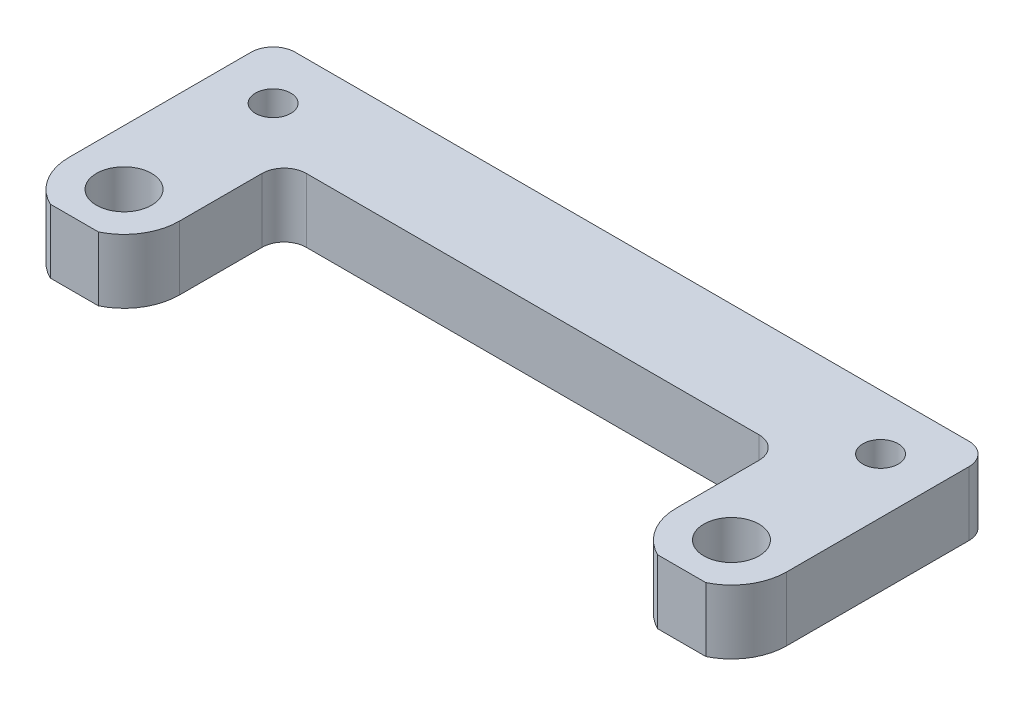
ISO-10303-21;
HEADER;
FILE_DESCRIPTION(('STEP AP214'),'2;1');
FILE_NAME('part.step','',(''),(''),'','','');
FILE_SCHEMA(('AUTOMOTIVE_DESIGN { 1 0 10303 214 1 1 1 1 }'));
ENDSEC;
DATA;
#1=APPLICATION_CONTEXT('core data for automotive mechanical design processes');
#2=APPLICATION_PROTOCOL_DEFINITION('international standard','automotive_design',2000,#1);
#3=PRODUCT_CONTEXT('',#1,'mechanical');
#4=PRODUCT('Part','Part','',(#3));
#5=PRODUCT_RELATED_PRODUCT_CATEGORY('part','',(#4));
#6=PRODUCT_DEFINITION_FORMATION('','',#4);
#7=PRODUCT_DEFINITION_CONTEXT('part definition',#1,'design');
#8=PRODUCT_DEFINITION('design','',#6,#7);
#9=PRODUCT_DEFINITION_SHAPE('','',#8);
#10=(LENGTH_UNIT() NAMED_UNIT(*) SI_UNIT(.MILLI.,.METRE.));
#11=(NAMED_UNIT(*) PLANE_ANGLE_UNIT() SI_UNIT($,.RADIAN.));
#12=(NAMED_UNIT(*) SI_UNIT($,.STERADIAN.) SOLID_ANGLE_UNIT());
#13=UNCERTAINTY_MEASURE_WITH_UNIT(LENGTH_MEASURE(1.E-05),#10,'distance_accuracy_value','');
#14=(GEOMETRIC_REPRESENTATION_CONTEXT(3) GLOBAL_UNCERTAINTY_ASSIGNED_CONTEXT((#13)) GLOBAL_UNIT_ASSIGNED_CONTEXT((#10,
#11,#12)) REPRESENTATION_CONTEXT('',''));
#15=CARTESIAN_POINT('',(0.,0.,0.));
#16=DIRECTION('',(0.,0.,1.));
#17=DIRECTION('',(1.,0.,0.));
#18=AXIS2_PLACEMENT_3D('',#15,#16,#17);
#19=CARTESIAN_POINT('',(-27.5,5.8,13.5));
#20=DIRECTION('',(0.,-1.,0.));
#21=DIRECTION('',(0.,0.,-1.));
#22=AXIS2_PLACEMENT_3D('',#19,#20,#21);
#23=CYLINDRICAL_SURFACE('',#22,5.);
#24=CARTESIAN_POINT('',(-27.5,0.,13.5));
#25=DIRECTION('',(0.,1.,0.));
#26=DIRECTION('',(0.,0.,1.));
#27=AXIS2_PLACEMENT_3D('',#24,#25,#26);
#28=CIRCLE('',#27,5.);
#29=CARTESIAN_POINT('',(-29.6794494717703,0.,18.));
#30=VERTEX_POINT('',#29);
#31=CARTESIAN_POINT('',(-32.5,0.,13.5));
#32=VERTEX_POINT('',#31);
#33=EDGE_CURVE('E158',#30,#32,#28,.F.);
#34=ORIENTED_EDGE('',*,*,#33,.F.);
#35=DIRECTION('',(0.,-1.,0.));
#36=VECTOR('',#35,1.);
#37=CARTESIAN_POINT('',(-29.6794494717703,5.8,18.));
#38=LINE('',#37,#36);
#39=CARTESIAN_POINT('',(-29.6794494717703,5.8,18.));
#40=VERTEX_POINT('',#39);
#41=EDGE_CURVE('E152',#40,#30,#38,.T.);
#42=ORIENTED_EDGE('',*,*,#41,.F.);
#43=CARTESIAN_POINT('',(-27.5,5.8,13.5));
#44=DIRECTION('',(0.,1.,0.));
#45=DIRECTION('',(0.,0.,1.));
#46=AXIS2_PLACEMENT_3D('',#43,#44,#45);
#47=CIRCLE('',#46,5.);
#48=CARTESIAN_POINT('',(-32.5,5.8,13.5));
#49=VERTEX_POINT('',#48);
#50=EDGE_CURVE('E156',#40,#49,#47,.F.);
#51=ORIENTED_EDGE('',*,*,#50,.T.);
#52=DIRECTION('',(0.,-1.,0.));
#53=VECTOR('',#52,1.);
#54=CARTESIAN_POINT('',(-32.5,5.8,13.5));
#55=LINE('',#54,#53);
#56=EDGE_CURVE('E312',#49,#32,#55,.T.);
#57=ORIENTED_EDGE('',*,*,#56,.T.);
#58=EDGE_LOOP('',(#34,#42,#51,#57));
#59=FACE_BOUND('',#58,.T.);
#60=ADVANCED_FACE('F37',(#59),#23,.T.);
#61=CARTESIAN_POINT('',(0.,5.8,18.));
#62=DIRECTION('',(0.,0.,-1.));
#63=DIRECTION('',(-1.,0.,0.));
#64=AXIS2_PLACEMENT_3D('',#61,#62,#63);
#65=PLANE('',#64);
#66=DIRECTION('',(1.,0.,0.));
#67=VECTOR('',#66,1.);
#68=CARTESIAN_POINT('',(0.,0.,18.));
#69=LINE('',#68,#67);
#70=CARTESIAN_POINT('',(-25.3205505282297,0.,18.));
#71=VERTEX_POINT('',#70);
#72=EDGE_CURVE('E314',#30,#71,#69,.T.);
#73=ORIENTED_EDGE('',*,*,#72,.T.);
#74=DIRECTION('',(0.,-1.,0.));
#75=VECTOR('',#74,1.);
#76=CARTESIAN_POINT('',(-25.3205505282297,5.8,18.));
#77=LINE('',#76,#75);
#78=CARTESIAN_POINT('',(-25.3205505282297,5.8,18.));
#79=VERTEX_POINT('',#78);
#80=EDGE_CURVE('E163',#79,#71,#77,.T.);
#81=ORIENTED_EDGE('',*,*,#80,.F.);
#82=DIRECTION('',(1.,0.,0.));
#83=VECTOR('',#82,1.);
#84=CARTESIAN_POINT('',(0.,5.8,18.));
#85=LINE('',#84,#83);
#86=EDGE_CURVE('E166',#40,#79,#85,.T.);
#87=ORIENTED_EDGE('',*,*,#86,.F.);
#88=ORIENTED_EDGE('',*,*,#41,.T.);
#89=EDGE_LOOP('',(#73,#81,#87,#88));
#90=FACE_BOUND('',#89,.T.);
#91=ADVANCED_FACE('F167',(#90),#65,.F.);
#92=CARTESIAN_POINT('',(-27.5,5.8,13.5));
#93=DIRECTION('',(0.,-1.,0.));
#94=DIRECTION('',(0.,0.,-1.));
#95=AXIS2_PLACEMENT_3D('',#92,#93,#94);
#96=CYLINDRICAL_SURFACE('',#95,5.);
#97=CARTESIAN_POINT('',(-27.5,0.,13.5));
#98=DIRECTION('',(0.,1.,0.));
#99=DIRECTION('',(0.,0.,1.));
#100=AXIS2_PLACEMENT_3D('',#97,#98,#99);
#101=CIRCLE('',#100,5.);
#102=CARTESIAN_POINT('',(-22.5,0.,13.5));
#103=VERTEX_POINT('',#102);
#104=EDGE_CURVE('E316',#103,#71,#101,.F.);
#105=ORIENTED_EDGE('',*,*,#104,.F.);
#106=DIRECTION('',(0.,-1.,0.));
#107=VECTOR('',#106,1.);
#108=CARTESIAN_POINT('',(-22.5,5.8,13.5));
#109=LINE('',#108,#107);
#110=CARTESIAN_POINT('',(-22.5,5.8,13.5));
#111=VERTEX_POINT('',#110);
#112=EDGE_CURVE('E348',#111,#103,#109,.T.);
#113=ORIENTED_EDGE('',*,*,#112,.F.);
#114=CARTESIAN_POINT('',(-27.5,5.8,13.5));
#115=DIRECTION('',(0.,1.,0.));
#116=DIRECTION('',(0.,0.,1.));
#117=AXIS2_PLACEMENT_3D('',#114,#115,#116);
#118=CIRCLE('',#117,5.);
#119=EDGE_CURVE('E170',#111,#79,#118,.F.);
#120=ORIENTED_EDGE('',*,*,#119,.T.);
#121=ORIENTED_EDGE('',*,*,#80,.T.);
#122=EDGE_LOOP('',(#105,#113,#120,#121));
#123=FACE_BOUND('',#122,.T.);
#124=ADVANCED_FACE('F351',(#123),#96,.T.);
#125=CARTESIAN_POINT('',(-22.5,5.8,0.));
#126=DIRECTION('',(-1.,0.,0.));
#127=DIRECTION('',(0.,0.,1.));
#128=AXIS2_PLACEMENT_3D('',#125,#126,#127);
#129=PLANE('',#128);
#130=DIRECTION('',(0.,0.,-1.));
#131=VECTOR('',#130,1.);
#132=CARTESIAN_POINT('',(-22.5,0.,0.));
#133=LINE('',#132,#131);
#134=CARTESIAN_POINT('',(-22.5,0.,6.));
#135=VERTEX_POINT('',#134);
#136=EDGE_CURVE('E258',#103,#135,#133,.T.);
#137=ORIENTED_EDGE('',*,*,#136,.T.);
#138=DIRECTION('',(0.,-1.,0.));
#139=VECTOR('',#138,1.);
#140=CARTESIAN_POINT('',(-22.5,5.8,6.));
#141=LINE('',#140,#139);
#142=CARTESIAN_POINT('',(-22.5,5.8,6.));
#143=VERTEX_POINT('',#142);
#144=EDGE_CURVE('E263',#135,#143,#141,.F.);
#145=ORIENTED_EDGE('',*,*,#144,.T.);
#146=DIRECTION('',(0.,0.,-1.));
#147=VECTOR('',#146,1.);
#148=CARTESIAN_POINT('',(-22.5,5.8,0.));
#149=LINE('',#148,#147);
#150=EDGE_CURVE('E192',#111,#143,#149,.T.);
#151=ORIENTED_EDGE('',*,*,#150,.F.);
#152=ORIENTED_EDGE('',*,*,#112,.T.);
#153=EDGE_LOOP('',(#137,#145,#151,#152));
#154=FACE_BOUND('',#153,.T.);
#155=ADVANCED_FACE('F355',(#154),#129,.F.);
#156=CARTESIAN_POINT('',(0.,5.8,4.));
#157=DIRECTION('',(0.,0.,-1.));
#158=DIRECTION('',(-1.,0.,0.));
#159=AXIS2_PLACEMENT_3D('',#156,#157,#158);
#160=PLANE('',#159);
#161=DIRECTION('',(1.,0.,0.));
#162=VECTOR('',#161,1.);
#163=CARTESIAN_POINT('',(0.,5.8,4.));
#164=LINE('',#163,#162);
#165=CARTESIAN_POINT('',(-20.5,5.8,4.));
#166=VERTEX_POINT('',#165);
#167=CARTESIAN_POINT('',(20.5,5.8,4.));
#168=VERTEX_POINT('',#167);
#169=EDGE_CURVE('E195',#166,#168,#164,.T.);
#170=ORIENTED_EDGE('',*,*,#169,.F.);
#171=DIRECTION('',(0.,-1.,0.));
#172=VECTOR('',#171,1.);
#173=CARTESIAN_POINT('',(-20.5,0.,4.));
#174=LINE('',#173,#172);
#175=CARTESIAN_POINT('',(-20.5,0.,4.));
#176=VERTEX_POINT('',#175);
#177=EDGE_CURVE('E257',#166,#176,#174,.T.);
#178=ORIENTED_EDGE('',*,*,#177,.T.);
#179=DIRECTION('',(1.,0.,0.));
#180=VECTOR('',#179,1.);
#181=CARTESIAN_POINT('',(0.,0.,4.));
#182=LINE('',#181,#180);
#183=CARTESIAN_POINT('',(20.5,0.,4.));
#184=VERTEX_POINT('',#183);
#185=EDGE_CURVE('E244',#176,#184,#182,.T.);
#186=ORIENTED_EDGE('',*,*,#185,.T.);
#187=DIRECTION('',(0.,-1.,0.));
#188=VECTOR('',#187,1.);
#189=CARTESIAN_POINT('',(20.5,5.8,4.));
#190=LINE('',#189,#188);
#191=EDGE_CURVE('E162',#184,#168,#190,.F.);
#192=ORIENTED_EDGE('',*,*,#191,.T.);
#193=EDGE_LOOP('',(#170,#178,#186,#192));
#194=FACE_BOUND('',#193,.T.);
#195=ADVANCED_FACE('F255',(#194),#160,.F.);
#196=CARTESIAN_POINT('',(22.5,5.8,0.));
#197=DIRECTION('',(-1.,0.,0.));
#198=DIRECTION('',(0.,0.,1.));
#199=AXIS2_PLACEMENT_3D('',#196,#197,#198);
#200=PLANE('',#199);
#201=DIRECTION('',(0.,0.,-1.));
#202=VECTOR('',#201,1.);
#203=CARTESIAN_POINT('',(22.5,5.8,0.));
#204=LINE('',#203,#202);
#205=CARTESIAN_POINT('',(22.5,5.8,13.5));
#206=VERTEX_POINT('',#205);
#207=CARTESIAN_POINT('',(22.5,5.8,6.));
#208=VERTEX_POINT('',#207);
#209=EDGE_CURVE('E199',#206,#208,#204,.T.);
#210=ORIENTED_EDGE('',*,*,#209,.T.);
#211=DIRECTION('',(0.,-1.,0.));
#212=VECTOR('',#211,1.);
#213=CARTESIAN_POINT('',(22.5,5.8,6.));
#214=LINE('',#213,#212);
#215=CARTESIAN_POINT('',(22.5,0.,6.));
#216=VERTEX_POINT('',#215);
#217=EDGE_CURVE('E268',#208,#216,#214,.T.);
#218=ORIENTED_EDGE('',*,*,#217,.T.);
#219=DIRECTION('',(0.,0.,-1.));
#220=VECTOR('',#219,1.);
#221=CARTESIAN_POINT('',(22.5,0.,0.));
#222=LINE('',#221,#220);
#223=CARTESIAN_POINT('',(22.5,0.,13.5));
#224=VERTEX_POINT('',#223);
#225=EDGE_CURVE('E247',#224,#216,#222,.T.);
#226=ORIENTED_EDGE('',*,*,#225,.F.);
#227=DIRECTION('',(0.,-1.,0.));
#228=VECTOR('',#227,1.);
#229=CARTESIAN_POINT('',(22.5,5.8,13.5));
#230=LINE('',#229,#228);
#231=EDGE_CURVE('E346',#206,#224,#230,.T.);
#232=ORIENTED_EDGE('',*,*,#231,.F.);
#233=EDGE_LOOP('',(#210,#218,#226,#232));
#234=FACE_BOUND('',#233,.T.);
#235=ADVANCED_FACE('F362',(#234),#200,.T.);
#236=CARTESIAN_POINT('',(27.5,5.8,13.5));
#237=DIRECTION('',(0.,-1.,0.));
#238=DIRECTION('',(0.,0.,-1.));
#239=AXIS2_PLACEMENT_3D('',#236,#237,#238);
#240=CYLINDRICAL_SURFACE('',#239,5.);
#241=CARTESIAN_POINT('',(27.5,0.,13.5));
#242=DIRECTION('',(0.,1.,0.));
#243=DIRECTION('',(0.,0.,1.));
#244=AXIS2_PLACEMENT_3D('',#241,#242,#243);
#245=CIRCLE('',#244,5.);
#246=CARTESIAN_POINT('',(25.3205505282297,0.,18.));
#247=VERTEX_POINT('',#246);
#248=EDGE_CURVE('E322',#224,#247,#245,.T.);
#249=ORIENTED_EDGE('',*,*,#248,.T.);
#250=DIRECTION('',(0.,-1.,0.));
#251=VECTOR('',#250,1.);
#252=CARTESIAN_POINT('',(25.3205505282297,5.8,18.));
#253=LINE('',#252,#251);
#254=CARTESIAN_POINT('',(25.3205505282297,5.8,18.));
#255=VERTEX_POINT('',#254);
#256=EDGE_CURVE('E344',#255,#247,#253,.T.);
#257=ORIENTED_EDGE('',*,*,#256,.F.);
#258=CARTESIAN_POINT('',(27.5,5.8,13.5));
#259=DIRECTION('',(0.,1.,0.));
#260=DIRECTION('',(0.,0.,1.));
#261=AXIS2_PLACEMENT_3D('',#258,#259,#260);
#262=CIRCLE('',#261,5.);
#263=EDGE_CURVE('E203',#206,#255,#262,.T.);
#264=ORIENTED_EDGE('',*,*,#263,.F.);
#265=ORIENTED_EDGE('',*,*,#231,.T.);
#266=EDGE_LOOP('',(#249,#257,#264,#265));
#267=FACE_BOUND('',#266,.T.);
#268=ADVANCED_FACE('F366',(#267),#240,.T.);
#269=CARTESIAN_POINT('',(0.,5.8,18.));
#270=DIRECTION('',(0.,0.,1.));
#271=DIRECTION('',(1.,0.,0.));
#272=AXIS2_PLACEMENT_3D('',#269,#270,#271);
#273=PLANE('',#272);
#274=DIRECTION('',(-1.,0.,0.));
#275=VECTOR('',#274,1.);
#276=CARTESIAN_POINT('',(0.,0.,18.));
#277=LINE('',#276,#275);
#278=CARTESIAN_POINT('',(29.6794494717703,0.,18.));
#279=VERTEX_POINT('',#278);
#280=EDGE_CURVE('E325',#279,#247,#277,.T.);
#281=ORIENTED_EDGE('',*,*,#280,.F.);
#282=DIRECTION('',(0.,-1.,0.));
#283=VECTOR('',#282,1.);
#284=CARTESIAN_POINT('',(29.6794494717703,5.8,18.));
#285=LINE('',#284,#283);
#286=CARTESIAN_POINT('',(29.6794494717703,5.8,18.));
#287=VERTEX_POINT('',#286);
#288=EDGE_CURVE('E342',#287,#279,#285,.T.);
#289=ORIENTED_EDGE('',*,*,#288,.F.);
#290=DIRECTION('',(-1.,0.,0.));
#291=VECTOR('',#290,1.);
#292=CARTESIAN_POINT('',(0.,5.8,18.));
#293=LINE('',#292,#291);
#294=EDGE_CURVE('E210',#287,#255,#293,.T.);
#295=ORIENTED_EDGE('',*,*,#294,.T.);
#296=ORIENTED_EDGE('',*,*,#256,.T.);
#297=EDGE_LOOP('',(#281,#289,#295,#296));
#298=FACE_BOUND('',#297,.T.);
#299=ADVANCED_FACE('F371',(#298),#273,.T.);
#300=CARTESIAN_POINT('',(27.5,5.8,13.5));
#301=DIRECTION('',(0.,-1.,0.));
#302=DIRECTION('',(0.,0.,-1.));
#303=AXIS2_PLACEMENT_3D('',#300,#301,#302);
#304=CYLINDRICAL_SURFACE('',#303,5.);
#305=CARTESIAN_POINT('',(27.5,0.,13.5));
#306=DIRECTION('',(0.,1.,0.));
#307=DIRECTION('',(0.,0.,1.));
#308=AXIS2_PLACEMENT_3D('',#305,#306,#307);
#309=CIRCLE('',#308,5.);
#310=CARTESIAN_POINT('',(32.5,0.,13.5));
#311=VERTEX_POINT('',#310);
#312=EDGE_CURVE('E289',#279,#311,#309,.T.);
#313=ORIENTED_EDGE('',*,*,#312,.T.);
#314=DIRECTION('',(0.,-1.,0.));
#315=VECTOR('',#314,1.);
#316=CARTESIAN_POINT('',(32.5,5.8,13.5));
#317=LINE('',#316,#315);
#318=CARTESIAN_POINT('',(32.5,5.8,13.5));
#319=VERTEX_POINT('',#318);
#320=EDGE_CURVE('E288',#319,#311,#317,.T.);
#321=ORIENTED_EDGE('',*,*,#320,.F.);
#322=CARTESIAN_POINT('',(27.5,5.8,13.5));
#323=DIRECTION('',(0.,1.,0.));
#324=DIRECTION('',(0.,0.,1.));
#325=AXIS2_PLACEMENT_3D('',#322,#323,#324);
#326=CIRCLE('',#325,5.);
#327=EDGE_CURVE('E213',#287,#319,#326,.T.);
#328=ORIENTED_EDGE('',*,*,#327,.F.);
#329=ORIENTED_EDGE('',*,*,#288,.T.);
#330=EDGE_LOOP('',(#313,#321,#328,#329));
#331=FACE_BOUND('',#330,.T.);
#332=ADVANCED_FACE('F373',(#331),#304,.T.);
#333=CARTESIAN_POINT('',(32.5,5.8,0.));
#334=DIRECTION('',(-1.,0.,0.));
#335=DIRECTION('',(0.,0.,1.));
#336=AXIS2_PLACEMENT_3D('',#333,#334,#335);
#337=PLANE('',#336);
#338=DIRECTION('',(0.,0.,-1.));
#339=VECTOR('',#338,1.);
#340=CARTESIAN_POINT('',(32.5,0.,0.));
#341=LINE('',#340,#339);
#342=CARTESIAN_POINT('',(32.5,0.,-3.));
#343=VERTEX_POINT('',#342);
#344=EDGE_CURVE('E280',#311,#343,#341,.T.);
#345=ORIENTED_EDGE('',*,*,#344,.T.);
#346=DIRECTION('',(0.,-1.,0.));
#347=VECTOR('',#346,1.);
#348=CARTESIAN_POINT('',(32.5,5.8,-3.));
#349=LINE('',#348,#347);
#350=CARTESIAN_POINT('',(32.5,5.8,-3.));
#351=VERTEX_POINT('',#350);
#352=EDGE_CURVE('E60',#343,#351,#349,.F.);
#353=ORIENTED_EDGE('',*,*,#352,.T.);
#354=DIRECTION('',(0.,0.,-1.));
#355=VECTOR('',#354,1.);
#356=CARTESIAN_POINT('',(32.5,5.8,0.));
#357=LINE('',#356,#355);
#358=EDGE_CURVE('E216',#319,#351,#357,.T.);
#359=ORIENTED_EDGE('',*,*,#358,.F.);
#360=ORIENTED_EDGE('',*,*,#320,.T.);
#361=EDGE_LOOP('',(#345,#353,#359,#360));
#362=FACE_BOUND('',#361,.T.);
#363=ADVANCED_FACE('F286',(#362),#337,.F.);
#364=CARTESIAN_POINT('',(0.,5.8,-5.));
#365=DIRECTION('',(0.,0.,-1.));
#366=DIRECTION('',(-1.,0.,0.));
#367=AXIS2_PLACEMENT_3D('',#364,#365,#366);
#368=PLANE('',#367);
#369=DIRECTION('',(1.,0.,0.));
#370=VECTOR('',#369,1.);
#371=CARTESIAN_POINT('',(0.,5.8,-5.));
#372=LINE('',#371,#370);
#373=CARTESIAN_POINT('',(-30.5,5.8,-5.));
#374=VERTEX_POINT('',#373);
#375=CARTESIAN_POINT('',(30.5,5.8,-5.));
#376=VERTEX_POINT('',#375);
#377=EDGE_CURVE('E219',#374,#376,#372,.T.);
#378=ORIENTED_EDGE('',*,*,#377,.T.);
#379=DIRECTION('',(0.,-1.,0.));
#380=VECTOR('',#379,1.);
#381=CARTESIAN_POINT('',(30.5,0.,-5.));
#382=LINE('',#381,#380);
#383=CARTESIAN_POINT('',(30.5,0.,-5.));
#384=VERTEX_POINT('',#383);
#385=EDGE_CURVE('E272',#376,#384,#382,.T.);
#386=ORIENTED_EDGE('',*,*,#385,.T.);
#387=DIRECTION('',(1.,0.,0.));
#388=VECTOR('',#387,1.);
#389=CARTESIAN_POINT('',(0.,0.,-5.));
#390=LINE('',#389,#388);
#391=CARTESIAN_POINT('',(-30.5,0.,-5.));
#392=VERTEX_POINT('',#391);
#393=EDGE_CURVE('E282',#392,#384,#390,.T.);
#394=ORIENTED_EDGE('',*,*,#393,.F.);
#395=DIRECTION('',(0.,-1.,0.));
#396=VECTOR('',#395,1.);
#397=CARTESIAN_POINT('',(-30.5,5.8,-5.));
#398=LINE('',#397,#396);
#399=EDGE_CURVE('E270',#392,#374,#398,.F.);
#400=ORIENTED_EDGE('',*,*,#399,.T.);
#401=EDGE_LOOP('',(#378,#386,#394,#400));
#402=FACE_BOUND('',#401,.T.);
#403=ADVANCED_FACE('F295',(#402),#368,.T.);
#404=CARTESIAN_POINT('',(27.5,5.8,13.5));
#405=DIRECTION('',(0.,-1.,0.));
#406=DIRECTION('',(0.,0.,-1.));
#407=AXIS2_PLACEMENT_3D('',#404,#405,#406);
#408=CYLINDRICAL_SURFACE('',#407,2.5);
#409=CARTESIAN_POINT('',(27.5,5.8,13.5));
#410=DIRECTION('',(0.,1.,0.));
#411=DIRECTION('',(0.,0.,1.));
#412=AXIS2_PLACEMENT_3D('',#409,#410,#411);
#413=CIRCLE('',#412,2.5);
#414=CARTESIAN_POINT('',(27.5,5.8,16.));
#415=VERTEX_POINT('',#414);
#416=EDGE_CURVE('E305',#415,#415,#413,.T.);
#417=ORIENTED_EDGE('',*,*,#416,.T.);
#418=EDGE_LOOP('',(#417));
#419=FACE_BOUND('',#418,.T.);
#420=CARTESIAN_POINT('',(27.5,0.,13.5));
#421=DIRECTION('',(0.,1.,0.));
#422=DIRECTION('',(0.,0.,1.));
#423=AXIS2_PLACEMENT_3D('',#420,#421,#422);
#424=CIRCLE('',#423,2.5);
#425=CARTESIAN_POINT('',(27.5,0.,16.));
#426=VERTEX_POINT('',#425);
#427=EDGE_CURVE('E179',#426,#426,#424,.T.);
#428=ORIENTED_EDGE('',*,*,#427,.F.);
#429=EDGE_LOOP('',(#428));
#430=FACE_BOUND('',#429,.T.);
#431=ADVANCED_FACE('F420',(#419,#430),#408,.F.);
#432=CARTESIAN_POINT('',(27.5,5.8,0.));
#433=DIRECTION('',(0.,-1.,0.));
#434=DIRECTION('',(0.,0.,-1.));
#435=AXIS2_PLACEMENT_3D('',#432,#433,#434);
#436=CYLINDRICAL_SURFACE('',#435,1.6);
#437=CARTESIAN_POINT('',(27.5,5.8,0.));
#438=DIRECTION('',(0.,1.,0.));
#439=DIRECTION('',(0.,0.,1.));
#440=AXIS2_PLACEMENT_3D('',#437,#438,#439);
#441=CIRCLE('',#440,1.6);
#442=CARTESIAN_POINT('',(27.5,5.8,1.6));
#443=VERTEX_POINT('',#442);
#444=EDGE_CURVE('E299',#443,#443,#441,.T.);
#445=ORIENTED_EDGE('',*,*,#444,.T.);
#446=EDGE_LOOP('',(#445));
#447=FACE_BOUND('',#446,.T.);
#448=CARTESIAN_POINT('',(27.5,0.,0.));
#449=DIRECTION('',(0.,1.,0.));
#450=DIRECTION('',(0.,0.,1.));
#451=AXIS2_PLACEMENT_3D('',#448,#449,#450);
#452=CIRCLE('',#451,1.6);
#453=CARTESIAN_POINT('',(27.5,0.,1.6));
#454=VERTEX_POINT('',#453);
#455=EDGE_CURVE('E335',#454,#454,#452,.T.);
#456=ORIENTED_EDGE('',*,*,#455,.F.);
#457=EDGE_LOOP('',(#456));
#458=FACE_BOUND('',#457,.T.);
#459=ADVANCED_FACE('F414',(#447,#458),#436,.F.);
#460=CARTESIAN_POINT('',(-27.5,5.8,0.));
#461=DIRECTION('',(0.,-1.,0.));
#462=DIRECTION('',(0.,0.,-1.));
#463=AXIS2_PLACEMENT_3D('',#460,#461,#462);
#464=CYLINDRICAL_SURFACE('',#463,1.6);
#465=CARTESIAN_POINT('',(-27.5,5.8,0.));
#466=DIRECTION('',(0.,1.,0.));
#467=DIRECTION('',(0.,0.,1.));
#468=AXIS2_PLACEMENT_3D('',#465,#466,#467);
#469=CIRCLE('',#468,1.6);
#470=CARTESIAN_POINT('',(-27.5,5.8,1.6));
#471=VERTEX_POINT('',#470);
#472=EDGE_CURVE('E297',#471,#471,#469,.F.);
#473=ORIENTED_EDGE('',*,*,#472,.F.);
#474=EDGE_LOOP('',(#473));
#475=FACE_BOUND('',#474,.T.);
#476=CARTESIAN_POINT('',(-27.5,0.,0.));
#477=DIRECTION('',(0.,1.,0.));
#478=DIRECTION('',(0.,0.,1.));
#479=AXIS2_PLACEMENT_3D('',#476,#477,#478);
#480=CIRCLE('',#479,1.6);
#481=CARTESIAN_POINT('',(-27.5,0.,1.6));
#482=VERTEX_POINT('',#481);
#483=EDGE_CURVE('E332',#482,#482,#480,.F.);
#484=ORIENTED_EDGE('',*,*,#483,.T.);
#485=EDGE_LOOP('',(#484));
#486=FACE_BOUND('',#485,.T.);
#487=ADVANCED_FACE('F406',(#475,#486),#464,.F.);
#488=CARTESIAN_POINT('',(-32.5,5.8,0.));
#489=DIRECTION('',(1.,0.,0.));
#490=DIRECTION('',(0.,0.,-1.));
#491=AXIS2_PLACEMENT_3D('',#488,#489,#490);
#492=PLANE('',#491);
#493=DIRECTION('',(0.,0.,1.));
#494=VECTOR('',#493,1.);
#495=CARTESIAN_POINT('',(-32.5,5.8,0.));
#496=LINE('',#495,#494);
#497=CARTESIAN_POINT('',(-32.5,5.8,-3.));
#498=VERTEX_POINT('',#497);
#499=EDGE_CURVE('E174',#498,#49,#496,.T.);
#500=ORIENTED_EDGE('',*,*,#499,.F.);
#501=DIRECTION('',(0.,-1.,0.));
#502=VECTOR('',#501,1.);
#503=CARTESIAN_POINT('',(-32.5,0.,-3.));
#504=LINE('',#503,#502);
#505=CARTESIAN_POINT('',(-32.5,0.,-3.));
#506=VERTEX_POINT('',#505);
#507=EDGE_CURVE('E229',#498,#506,#504,.T.);
#508=ORIENTED_EDGE('',*,*,#507,.T.);
#509=DIRECTION('',(0.,0.,1.));
#510=VECTOR('',#509,1.);
#511=CARTESIAN_POINT('',(-32.5,0.,0.));
#512=LINE('',#511,#510);
#513=EDGE_CURVE('E330',#506,#32,#512,.T.);
#514=ORIENTED_EDGE('',*,*,#513,.T.);
#515=ORIENTED_EDGE('',*,*,#56,.F.);
#516=EDGE_LOOP('',(#500,#508,#514,#515));
#517=FACE_BOUND('',#516,.T.);
#518=ADVANCED_FACE('F403',(#517),#492,.F.);
#519=CARTESIAN_POINT('',(-27.5,5.8,13.5));
#520=DIRECTION('',(0.,-1.,0.));
#521=DIRECTION('',(0.,0.,-1.));
#522=AXIS2_PLACEMENT_3D('',#519,#520,#521);
#523=CYLINDRICAL_SURFACE('',#522,2.5);
#524=CARTESIAN_POINT('',(-27.5,5.8,13.5));
#525=DIRECTION('',(0.,1.,0.));
#526=DIRECTION('',(0.,0.,1.));
#527=AXIS2_PLACEMENT_3D('',#524,#525,#526);
#528=CIRCLE('',#527,2.5);
#529=CARTESIAN_POINT('',(-27.5,5.8,16.));
#530=VERTEX_POINT('',#529);
#531=EDGE_CURVE('E309',#530,#530,#528,.F.);
#532=ORIENTED_EDGE('',*,*,#531,.F.);
#533=EDGE_LOOP('',(#532));
#534=FACE_BOUND('',#533,.T.);
#535=CARTESIAN_POINT('',(-27.5,0.,13.5));
#536=DIRECTION('',(0.,1.,0.));
#537=DIRECTION('',(0.,0.,1.));
#538=AXIS2_PLACEMENT_3D('',#535,#536,#537);
#539=CIRCLE('',#538,2.5);
#540=CARTESIAN_POINT('',(-27.5,0.,16.));
#541=VERTEX_POINT('',#540);
#542=EDGE_CURVE('E176',#541,#541,#539,.F.);
#543=ORIENTED_EDGE('',*,*,#542,.T.);
#544=EDGE_LOOP('',(#543));
#545=FACE_BOUND('',#544,.T.);
#546=ADVANCED_FACE('F405',(#534,#545),#523,.F.);
#547=CARTESIAN_POINT('',(0.,5.8,0.));
#548=DIRECTION('',(0.,1.,0.));
#549=DIRECTION('',(0.,0.,1.));
#550=AXIS2_PLACEMENT_3D('',#547,#548,#549);
#551=PLANE('',#550);
#552=ORIENTED_EDGE('',*,*,#358,.T.);
#553=CARTESIAN_POINT('',(30.5,5.8,-3.));
#554=DIRECTION('',(0.,1.,0.));
#555=DIRECTION('',(0.,0.,1.));
#556=AXIS2_PLACEMENT_3D('',#553,#554,#555);
#557=CIRCLE('',#556,2.);
#558=EDGE_CURVE('E225',#351,#376,#557,.T.);
#559=ORIENTED_EDGE('',*,*,#558,.T.);
#560=ORIENTED_EDGE('',*,*,#377,.F.);
#561=CARTESIAN_POINT('',(-30.5,5.8,-3.));
#562=DIRECTION('',(0.,1.,0.));
#563=DIRECTION('',(0.,0.,1.));
#564=AXIS2_PLACEMENT_3D('',#561,#562,#563);
#565=CIRCLE('',#564,2.);
#566=EDGE_CURVE('E52',#374,#498,#565,.T.);
#567=ORIENTED_EDGE('',*,*,#566,.T.);
#568=ORIENTED_EDGE('',*,*,#499,.T.);
#569=ORIENTED_EDGE('',*,*,#50,.F.);
#570=ORIENTED_EDGE('',*,*,#86,.T.);
#571=ORIENTED_EDGE('',*,*,#119,.F.);
#572=ORIENTED_EDGE('',*,*,#150,.T.);
#573=CARTESIAN_POINT('',(-20.5,5.8,6.));
#574=DIRECTION('',(0.,1.,0.));
#575=DIRECTION('',(0.,0.,1.));
#576=AXIS2_PLACEMENT_3D('',#573,#574,#575);
#577=CIRCLE('',#576,2.);
#578=EDGE_CURVE('E236',#143,#166,#577,.F.);
#579=ORIENTED_EDGE('',*,*,#578,.T.);
#580=ORIENTED_EDGE('',*,*,#169,.T.);
#581=CARTESIAN_POINT('',(20.5,5.8,6.));
#582=DIRECTION('',(0.,1.,0.));
#583=DIRECTION('',(0.,0.,1.));
#584=AXIS2_PLACEMENT_3D('',#581,#582,#583);
#585=CIRCLE('',#584,2.);
#586=EDGE_CURVE('E12',#168,#208,#585,.F.);
#587=ORIENTED_EDGE('',*,*,#586,.T.);
#588=ORIENTED_EDGE('',*,*,#209,.F.);
#589=ORIENTED_EDGE('',*,*,#263,.T.);
#590=ORIENTED_EDGE('',*,*,#294,.F.);
#591=ORIENTED_EDGE('',*,*,#327,.T.);
#592=EDGE_LOOP('',(#552,#559,#560,#567,#568,#569,#570,#571,#572,#579,#580,#587,#588,#589,#590,#591));
#593=FACE_BOUND('',#592,.T.);
#594=ORIENTED_EDGE('',*,*,#472,.T.);
#595=EDGE_LOOP('',(#594));
#596=FACE_BOUND('',#595,.T.);
#597=ORIENTED_EDGE('',*,*,#444,.F.);
#598=EDGE_LOOP('',(#597));
#599=FACE_BOUND('',#598,.T.);
#600=ORIENTED_EDGE('',*,*,#416,.F.);
#601=EDGE_LOOP('',(#600));
#602=FACE_BOUND('',#601,.T.);
#603=ORIENTED_EDGE('',*,*,#531,.T.);
#604=EDGE_LOOP('',(#603));
#605=FACE_BOUND('',#604,.T.);
#606=ADVANCED_FACE('F172',(#593,#596,#599,#602,#605),#551,.T.);
#607=CARTESIAN_POINT('',(0.,0.,0.));
#608=DIRECTION('',(0.,1.,0.));
#609=DIRECTION('',(0.,0.,1.));
#610=AXIS2_PLACEMENT_3D('',#607,#608,#609);
#611=PLANE('',#610);
#612=ORIENTED_EDGE('',*,*,#393,.T.);
#613=CARTESIAN_POINT('',(30.5,0.,-3.));
#614=DIRECTION('',(0.,1.,0.));
#615=DIRECTION('',(0.,0.,1.));
#616=AXIS2_PLACEMENT_3D('',#613,#614,#615);
#617=CIRCLE('',#616,2.);
#618=EDGE_CURVE('E277',#384,#343,#617,.F.);
#619=ORIENTED_EDGE('',*,*,#618,.T.);
#620=ORIENTED_EDGE('',*,*,#344,.F.);
#621=ORIENTED_EDGE('',*,*,#312,.F.);
#622=ORIENTED_EDGE('',*,*,#280,.T.);
#623=ORIENTED_EDGE('',*,*,#248,.F.);
#624=ORIENTED_EDGE('',*,*,#225,.T.);
#625=CARTESIAN_POINT('',(20.5,0.,6.));
#626=DIRECTION('',(0.,1.,0.));
#627=DIRECTION('',(0.,0.,1.));
#628=AXIS2_PLACEMENT_3D('',#625,#626,#627);
#629=CIRCLE('',#628,2.);
#630=EDGE_CURVE('E45',#216,#184,#629,.T.);
#631=ORIENTED_EDGE('',*,*,#630,.T.);
#632=ORIENTED_EDGE('',*,*,#185,.F.);
#633=CARTESIAN_POINT('',(-20.5,0.,6.));
#634=DIRECTION('',(0.,1.,0.));
#635=DIRECTION('',(0.,0.,1.));
#636=AXIS2_PLACEMENT_3D('',#633,#634,#635);
#637=CIRCLE('',#636,2.);
#638=EDGE_CURVE('E234',#176,#135,#637,.T.);
#639=ORIENTED_EDGE('',*,*,#638,.T.);
#640=ORIENTED_EDGE('',*,*,#136,.F.);
#641=ORIENTED_EDGE('',*,*,#104,.T.);
#642=ORIENTED_EDGE('',*,*,#72,.F.);
#643=ORIENTED_EDGE('',*,*,#33,.T.);
#644=ORIENTED_EDGE('',*,*,#513,.F.);
#645=CARTESIAN_POINT('',(-30.5,0.,-3.));
#646=DIRECTION('',(0.,1.,0.));
#647=DIRECTION('',(0.,0.,1.));
#648=AXIS2_PLACEMENT_3D('',#645,#646,#647);
#649=CIRCLE('',#648,2.);
#650=EDGE_CURVE('E275',#506,#392,#649,.F.);
#651=ORIENTED_EDGE('',*,*,#650,.T.);
#652=EDGE_LOOP('',(#612,#619,#620,#621,#622,#623,#624,#631,#632,#639,#640,#641,#642,#643,#644,#651));
#653=FACE_BOUND('',#652,.T.);
#654=ORIENTED_EDGE('',*,*,#483,.F.);
#655=EDGE_LOOP('',(#654));
#656=FACE_BOUND('',#655,.T.);
#657=ORIENTED_EDGE('',*,*,#455,.T.);
#658=EDGE_LOOP('',(#657));
#659=FACE_BOUND('',#658,.T.);
#660=ORIENTED_EDGE('',*,*,#427,.T.);
#661=EDGE_LOOP('',(#660));
#662=FACE_BOUND('',#661,.T.);
#663=ORIENTED_EDGE('',*,*,#542,.F.);
#664=EDGE_LOOP('',(#663));
#665=FACE_BOUND('',#664,.T.);
#666=ADVANCED_FACE('F242',(#653,#656,#659,#662,#665),#611,.F.);
#667=CARTESIAN_POINT('',(-20.5,5.8,6.));
#668=DIRECTION('',(0.,1.,0.));
#669=DIRECTION('',(0.,0.,1.));
#670=AXIS2_PLACEMENT_3D('',#667,#668,#669);
#671=CYLINDRICAL_SURFACE('',#670,2.);
#672=ORIENTED_EDGE('',*,*,#578,.F.);
#673=ORIENTED_EDGE('',*,*,#144,.F.);
#674=ORIENTED_EDGE('',*,*,#638,.F.);
#675=ORIENTED_EDGE('',*,*,#177,.F.);
#676=EDGE_LOOP('',(#672,#673,#674,#675));
#677=FACE_BOUND('',#676,.T.);
#678=ADVANCED_FACE('F359',(#677),#671,.F.);
#679=CARTESIAN_POINT('',(20.5,5.8,6.));
#680=DIRECTION('',(0.,-1.,0.));
#681=DIRECTION('',(0.,0.,-1.));
#682=AXIS2_PLACEMENT_3D('',#679,#680,#681);
#683=CYLINDRICAL_SURFACE('',#682,2.);
#684=ORIENTED_EDGE('',*,*,#586,.F.);
#685=ORIENTED_EDGE('',*,*,#191,.F.);
#686=ORIENTED_EDGE('',*,*,#630,.F.);
#687=ORIENTED_EDGE('',*,*,#217,.F.);
#688=EDGE_LOOP('',(#684,#685,#686,#687));
#689=FACE_BOUND('',#688,.T.);
#690=ADVANCED_FACE('F261',(#689),#683,.F.);
#691=CARTESIAN_POINT('',(30.5,5.8,-3.));
#692=DIRECTION('',(0.,1.,0.));
#693=DIRECTION('',(0.,0.,1.));
#694=AXIS2_PLACEMENT_3D('',#691,#692,#693);
#695=CYLINDRICAL_SURFACE('',#694,2.);
#696=ORIENTED_EDGE('',*,*,#558,.F.);
#697=ORIENTED_EDGE('',*,*,#352,.F.);
#698=ORIENTED_EDGE('',*,*,#618,.F.);
#699=ORIENTED_EDGE('',*,*,#385,.F.);
#700=EDGE_LOOP('',(#696,#697,#698,#699));
#701=FACE_BOUND('',#700,.T.);
#702=ADVANCED_FACE('F292',(#701),#695,.T.);
#703=CARTESIAN_POINT('',(-30.5,5.8,-3.));
#704=DIRECTION('',(0.,1.,0.));
#705=DIRECTION('',(0.,0.,1.));
#706=AXIS2_PLACEMENT_3D('',#703,#704,#705);
#707=CYLINDRICAL_SURFACE('',#706,2.);
#708=ORIENTED_EDGE('',*,*,#566,.F.);
#709=ORIENTED_EDGE('',*,*,#399,.F.);
#710=ORIENTED_EDGE('',*,*,#650,.F.);
#711=ORIENTED_EDGE('',*,*,#507,.F.);
#712=EDGE_LOOP('',(#708,#709,#710,#711));
#713=FACE_BOUND('',#712,.T.);
#714=ADVANCED_FACE('F39',(#713),#707,.T.);
#715=CLOSED_SHELL('',(#60,#91,#124,#155,#195,#235,#268,#299,#332,#363,#403,#431,#459,#487,#518,
#546,#606,#666,#678,#690,#702,#714));
#716=MANIFOLD_SOLID_BREP('B2',#715);
#717=ADVANCED_BREP_SHAPE_REPRESENTATION('',(#18,#716),#14);
#718=SHAPE_DEFINITION_REPRESENTATION(#9,#717);
ENDSEC;
END-ISO-10303-21;
